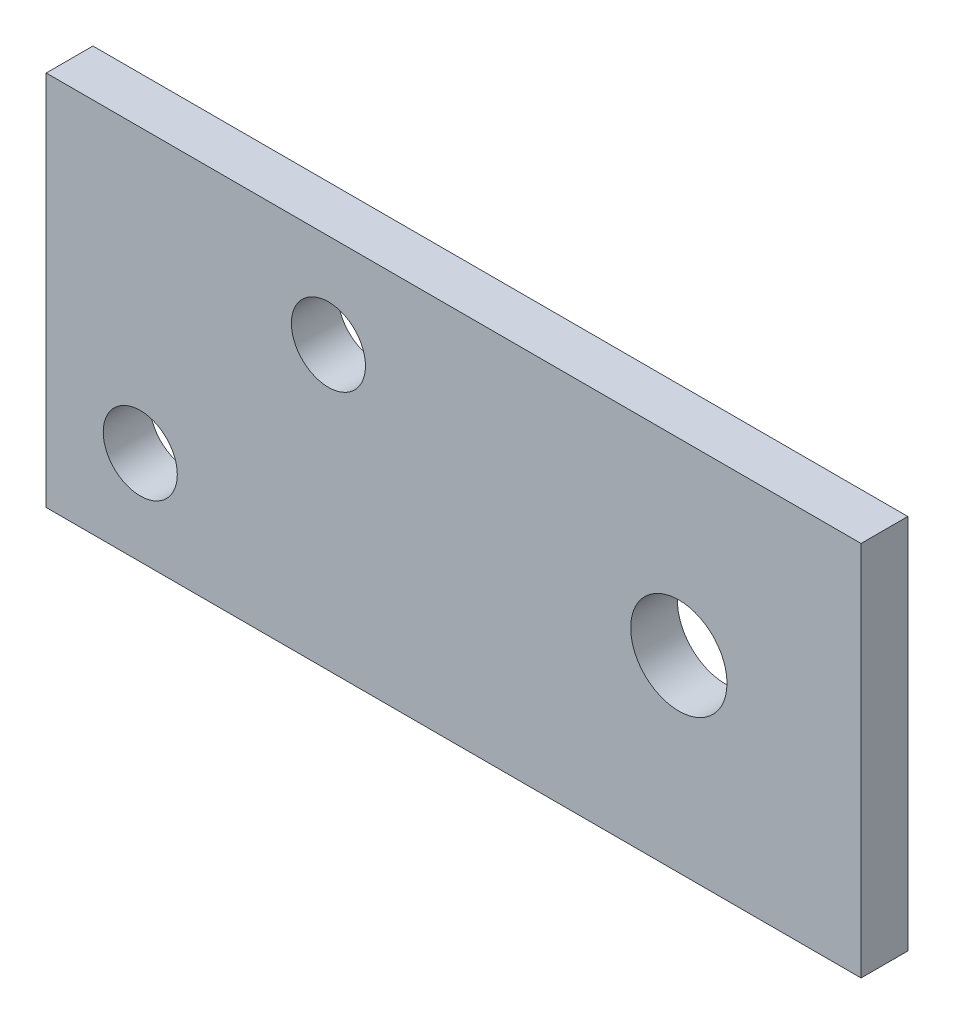
ISO-10303-21;
HEADER;
FILE_DESCRIPTION(('STEP AP214'),'2;1');
FILE_NAME('part.step','',(''),(''),'','','');
FILE_SCHEMA(('AUTOMOTIVE_DESIGN { 1 0 10303 214 1 1 1 1 }'));
ENDSEC;
DATA;
#1=APPLICATION_CONTEXT('core data for automotive mechanical design processes');
#2=APPLICATION_PROTOCOL_DEFINITION('international standard','automotive_design',2000,#1);
#3=PRODUCT_CONTEXT('',#1,'mechanical');
#4=PRODUCT('Part','Part','',(#3));
#5=PRODUCT_RELATED_PRODUCT_CATEGORY('part','',(#4));
#6=PRODUCT_DEFINITION_FORMATION('','',#4);
#7=PRODUCT_DEFINITION_CONTEXT('part definition',#1,'design');
#8=PRODUCT_DEFINITION('design','',#6,#7);
#9=PRODUCT_DEFINITION_SHAPE('','',#8);
#10=(LENGTH_UNIT() NAMED_UNIT(*) SI_UNIT(.MILLI.,.METRE.));
#11=(NAMED_UNIT(*) PLANE_ANGLE_UNIT() SI_UNIT($,.RADIAN.));
#12=(NAMED_UNIT(*) SI_UNIT($,.STERADIAN.) SOLID_ANGLE_UNIT());
#13=UNCERTAINTY_MEASURE_WITH_UNIT(LENGTH_MEASURE(1.E-05),#10,'distance_accuracy_value','');
#14=(GEOMETRIC_REPRESENTATION_CONTEXT(3) GLOBAL_UNCERTAINTY_ASSIGNED_CONTEXT((#13)) GLOBAL_UNIT_ASSIGNED_CONTEXT((#10,
#11,#12)) REPRESENTATION_CONTEXT('',''));
#15=CARTESIAN_POINT('',(0.,0.,0.));
#16=DIRECTION('',(0.,0.,1.));
#17=DIRECTION('',(1.,0.,0.));
#18=AXIS2_PLACEMENT_3D('',#15,#16,#17);
#19=CARTESIAN_POINT('',(0.,0.,6.31));
#20=DIRECTION('',(0.,0.,1.));
#21=DIRECTION('',(1.,0.,0.));
#22=AXIS2_PLACEMENT_3D('',#19,#20,#21);
#23=PLANE('',#22);
#24=CARTESIAN_POINT('',(-71.9,38.1,6.31));
#25=DIRECTION('',(0.,0.,1.));
#26=DIRECTION('',(1.,0.,0.));
#27=AXIS2_PLACEMENT_3D('',#24,#25,#26);
#28=CIRCLE('',#27,5.00000000000001);
#29=CARTESIAN_POINT('',(-66.9,38.1,6.31));
#30=VERTEX_POINT('',#29);
#31=EDGE_CURVE('E127',#30,#30,#28,.T.);
#32=ORIENTED_EDGE('',*,*,#31,.F.);
#33=EDGE_LOOP('',(#32));
#34=FACE_BOUND('',#33,.T.);
#35=CARTESIAN_POINT('',(-97.3,12.7,6.31));
#36=DIRECTION('',(0.,0.,1.));
#37=DIRECTION('',(1.,0.,0.));
#38=AXIS2_PLACEMENT_3D('',#35,#36,#37);
#39=CIRCLE('',#38,5.);
#40=CARTESIAN_POINT('',(-92.3,12.7,6.31));
#41=VERTEX_POINT('',#40);
#42=EDGE_CURVE('E117',#41,#41,#39,.T.);
#43=ORIENTED_EDGE('',*,*,#42,.F.);
#44=EDGE_LOOP('',(#43));
#45=FACE_BOUND('',#44,.T.);
#46=DIRECTION('',(-1.,0.,0.));
#47=VECTOR('',#46,1.);
#48=CARTESIAN_POINT('',(0.,50.8,6.31));
#49=LINE('',#48,#47);
#50=CARTESIAN_POINT('',(0.,50.8,6.31));
#51=VERTEX_POINT('',#50);
#52=CARTESIAN_POINT('',(-110.,50.8,6.31));
#53=VERTEX_POINT('',#52);
#54=EDGE_CURVE('E79',#51,#53,#49,.T.);
#55=ORIENTED_EDGE('',*,*,#54,.T.);
#56=DIRECTION('',(0.,-1.,0.));
#57=VECTOR('',#56,1.);
#58=CARTESIAN_POINT('',(-110.,50.8,6.31));
#59=LINE('',#58,#57);
#60=CARTESIAN_POINT('',(-110.,0.,6.31));
#61=VERTEX_POINT('',#60);
#62=EDGE_CURVE('E82',#53,#61,#59,.T.);
#63=ORIENTED_EDGE('',*,*,#62,.T.);
#64=DIRECTION('',(1.,0.,0.));
#65=VECTOR('',#64,1.);
#66=CARTESIAN_POINT('',(-110.,0.,6.31));
#67=LINE('',#66,#65);
#68=CARTESIAN_POINT('',(0.,0.,6.31));
#69=VERTEX_POINT('',#68);
#70=EDGE_CURVE('E86',#61,#69,#67,.T.);
#71=ORIENTED_EDGE('',*,*,#70,.T.);
#72=DIRECTION('',(0.,1.,0.));
#73=VECTOR('',#72,1.);
#74=CARTESIAN_POINT('',(0.,0.,6.31));
#75=LINE('',#74,#73);
#76=EDGE_CURVE('E50',#69,#51,#75,.T.);
#77=ORIENTED_EDGE('',*,*,#76,.T.);
#78=EDGE_LOOP('',(#55,#63,#71,#77));
#79=FACE_BOUND('',#78,.T.);
#80=CARTESIAN_POINT('',(-24.5999999998908,25.4013417539825,6.31));
#81=DIRECTION('',(0.,0.,1.));
#82=DIRECTION('',(1.,0.,0.));
#83=AXIS2_PLACEMENT_3D('',#80,#81,#82);
#84=CIRCLE('',#83,6.50134175398248);
#85=CARTESIAN_POINT('',(-18.0986582459083,25.4013417539825,6.31));
#86=VERTEX_POINT('',#85);
#87=EDGE_CURVE('E99',#86,#86,#84,.T.);
#88=ORIENTED_EDGE('',*,*,#87,.F.);
#89=EDGE_LOOP('',(#88));
#90=FACE_BOUND('',#89,.T.);
#91=ADVANCED_FACE('F33',(#34,#45,#79,#90),#23,.T.);
#92=CARTESIAN_POINT('',(0.,0.,0.));
#93=DIRECTION('',(0.,0.,1.));
#94=DIRECTION('',(1.,0.,0.));
#95=AXIS2_PLACEMENT_3D('',#92,#93,#94);
#96=PLANE('',#95);
#97=CARTESIAN_POINT('',(-71.9,38.1,0.));
#98=DIRECTION('',(0.,0.,-1.));
#99=DIRECTION('',(-1.,0.,0.));
#100=AXIS2_PLACEMENT_3D('',#97,#98,#99);
#101=CIRCLE('',#100,5.00000000000001);
#102=CARTESIAN_POINT('',(-76.9,38.1,0.));
#103=VERTEX_POINT('',#102);
#104=EDGE_CURVE('E130',#103,#103,#101,.T.);
#105=ORIENTED_EDGE('',*,*,#104,.F.);
#106=EDGE_LOOP('',(#105));
#107=FACE_BOUND('',#106,.T.);
#108=CARTESIAN_POINT('',(-97.3,12.7,0.));
#109=DIRECTION('',(0.,0.,-1.));
#110=DIRECTION('',(-1.,0.,0.));
#111=AXIS2_PLACEMENT_3D('',#108,#109,#110);
#112=CIRCLE('',#111,5.);
#113=CARTESIAN_POINT('',(-102.3,12.7,0.));
#114=VERTEX_POINT('',#113);
#115=EDGE_CURVE('E122',#114,#114,#112,.T.);
#116=ORIENTED_EDGE('',*,*,#115,.F.);
#117=EDGE_LOOP('',(#116));
#118=FACE_BOUND('',#117,.T.);
#119=DIRECTION('',(-1.,0.,0.));
#120=VECTOR('',#119,1.);
#121=CARTESIAN_POINT('',(-59.2,50.8,0.));
#122=LINE('',#121,#120);
#123=CARTESIAN_POINT('',(0.,50.8,0.));
#124=VERTEX_POINT('',#123);
#125=CARTESIAN_POINT('',(-110.,50.8,0.));
#126=VERTEX_POINT('',#125);
#127=EDGE_CURVE('E74',#124,#126,#122,.T.);
#128=ORIENTED_EDGE('',*,*,#127,.F.);
#129=DIRECTION('',(0.,1.,0.));
#130=VECTOR('',#129,1.);
#131=CARTESIAN_POINT('',(0.,0.,0.));
#132=LINE('',#131,#130);
#133=CARTESIAN_POINT('',(0.,0.,0.));
#134=VERTEX_POINT('',#133);
#135=EDGE_CURVE('E102',#134,#124,#132,.T.);
#136=ORIENTED_EDGE('',*,*,#135,.F.);
#137=DIRECTION('',(1.,0.,0.));
#138=VECTOR('',#137,1.);
#139=CARTESIAN_POINT('',(-110.,0.,0.));
#140=LINE('',#139,#138);
#141=CARTESIAN_POINT('',(-110.,0.,0.));
#142=VERTEX_POINT('',#141);
#143=EDGE_CURVE('E67',#142,#134,#140,.T.);
#144=ORIENTED_EDGE('',*,*,#143,.F.);
#145=DIRECTION('',(0.,-1.,0.));
#146=VECTOR('',#145,1.);
#147=CARTESIAN_POINT('',(-110.,50.8,0.));
#148=LINE('',#147,#146);
#149=EDGE_CURVE('E90',#126,#142,#148,.T.);
#150=ORIENTED_EDGE('',*,*,#149,.F.);
#151=EDGE_LOOP('',(#128,#136,#144,#150));
#152=FACE_BOUND('',#151,.T.);
#153=CARTESIAN_POINT('',(-24.5999999998908,25.4013417539825,0.));
#154=DIRECTION('',(0.,0.,1.));
#155=DIRECTION('',(1.,0.,0.));
#156=AXIS2_PLACEMENT_3D('',#153,#154,#155);
#157=CIRCLE('',#156,6.50134175398248);
#158=CARTESIAN_POINT('',(-18.0986582459083,25.4013417539825,0.));
#159=VERTEX_POINT('',#158);
#160=EDGE_CURVE('E115',#159,#159,#157,.T.);
#161=ORIENTED_EDGE('',*,*,#160,.T.);
#162=EDGE_LOOP('',(#161));
#163=FACE_BOUND('',#162,.T.);
#164=ADVANCED_FACE('F108',(#107,#118,#152,#163),#96,.F.);
#165=CARTESIAN_POINT('',(-59.2,50.8,6.31));
#166=DIRECTION('',(0.,-1.,0.));
#167=DIRECTION('',(1.,0.,0.));
#168=AXIS2_PLACEMENT_3D('',#165,#166,#167);
#169=PLANE('',#168);
#170=ORIENTED_EDGE('',*,*,#127,.T.);
#171=DIRECTION('',(0.,0.,-1.));
#172=VECTOR('',#171,1.);
#173=CARTESIAN_POINT('',(-110.,50.8,6.31));
#174=LINE('',#173,#172);
#175=EDGE_CURVE('E11',#53,#126,#174,.T.);
#176=ORIENTED_EDGE('',*,*,#175,.F.);
#177=ORIENTED_EDGE('',*,*,#54,.F.);
#178=DIRECTION('',(0.,0.,-1.));
#179=VECTOR('',#178,1.);
#180=CARTESIAN_POINT('',(0.,50.8,6.31));
#181=LINE('',#180,#179);
#182=EDGE_CURVE('E94',#51,#124,#181,.T.);
#183=ORIENTED_EDGE('',*,*,#182,.T.);
#184=EDGE_LOOP('',(#170,#176,#177,#183));
#185=FACE_BOUND('',#184,.T.);
#186=ADVANCED_FACE('F35',(#185),#169,.F.);
#187=CARTESIAN_POINT('',(-110.,50.8,6.31));
#188=DIRECTION('',(1.,0.,0.));
#189=DIRECTION('',(0.,0.,-1.));
#190=AXIS2_PLACEMENT_3D('',#187,#188,#189);
#191=PLANE('',#190);
#192=ORIENTED_EDGE('',*,*,#149,.T.);
#193=DIRECTION('',(0.,0.,-1.));
#194=VECTOR('',#193,1.);
#195=CARTESIAN_POINT('',(-110.,0.,6.31));
#196=LINE('',#195,#194);
#197=EDGE_CURVE('E42',#61,#142,#196,.T.);
#198=ORIENTED_EDGE('',*,*,#197,.F.);
#199=ORIENTED_EDGE('',*,*,#62,.F.);
#200=ORIENTED_EDGE('',*,*,#175,.T.);
#201=EDGE_LOOP('',(#192,#198,#199,#200));
#202=FACE_BOUND('',#201,.T.);
#203=ADVANCED_FACE('F89',(#202),#191,.F.);
#204=CARTESIAN_POINT('',(-110.,0.,6.31));
#205=DIRECTION('',(0.,1.,0.));
#206=DIRECTION('',(0.,0.,1.));
#207=AXIS2_PLACEMENT_3D('',#204,#205,#206);
#208=PLANE('',#207);
#209=ORIENTED_EDGE('',*,*,#143,.T.);
#210=DIRECTION('',(0.,0.,-1.));
#211=VECTOR('',#210,1.);
#212=CARTESIAN_POINT('',(0.,0.,6.31));
#213=LINE('',#212,#211);
#214=EDGE_CURVE('E91',#69,#134,#213,.T.);
#215=ORIENTED_EDGE('',*,*,#214,.F.);
#216=ORIENTED_EDGE('',*,*,#70,.F.);
#217=ORIENTED_EDGE('',*,*,#197,.T.);
#218=EDGE_LOOP('',(#209,#215,#216,#217));
#219=FACE_BOUND('',#218,.T.);
#220=ADVANCED_FACE('F92',(#219),#208,.F.);
#221=CARTESIAN_POINT('',(0.,0.,6.31));
#222=DIRECTION('',(-1.,0.,0.));
#223=DIRECTION('',(0.,0.,1.));
#224=AXIS2_PLACEMENT_3D('',#221,#222,#223);
#225=PLANE('',#224);
#226=ORIENTED_EDGE('',*,*,#135,.T.);
#227=ORIENTED_EDGE('',*,*,#182,.F.);
#228=ORIENTED_EDGE('',*,*,#76,.F.);
#229=ORIENTED_EDGE('',*,*,#214,.T.);
#230=EDGE_LOOP('',(#226,#227,#228,#229));
#231=FACE_BOUND('',#230,.T.);
#232=ADVANCED_FACE('F107',(#231),#225,.F.);
#233=CARTESIAN_POINT('',(-24.5999999998908,25.4013417539825,6.31));
#234=DIRECTION('',(0.,0.,-1.));
#235=DIRECTION('',(-1.,0.,0.));
#236=AXIS2_PLACEMENT_3D('',#233,#234,#235);
#237=CYLINDRICAL_SURFACE('',#236,6.50134175398248);
#238=ORIENTED_EDGE('',*,*,#87,.T.);
#239=EDGE_LOOP('',(#238));
#240=FACE_BOUND('',#239,.T.);
#241=ORIENTED_EDGE('',*,*,#160,.F.);
#242=EDGE_LOOP('',(#241));
#243=FACE_BOUND('',#242,.T.);
#244=ADVANCED_FACE('F140',(#240,#243),#237,.F.);
#245=CARTESIAN_POINT('',(-97.3,12.7,10.));
#246=DIRECTION('',(0.,0.,-1.));
#247=DIRECTION('',(-1.,0.,0.));
#248=AXIS2_PLACEMENT_3D('',#245,#246,#247);
#249=CYLINDRICAL_SURFACE('',#248,5.);
#250=ORIENTED_EDGE('',*,*,#42,.T.);
#251=EDGE_LOOP('',(#250));
#252=FACE_BOUND('',#251,.T.);
#253=ORIENTED_EDGE('',*,*,#115,.T.);
#254=EDGE_LOOP('',(#253));
#255=FACE_BOUND('',#254,.T.);
#256=ADVANCED_FACE('F138',(#252,#255),#249,.F.);
#257=CARTESIAN_POINT('',(-71.9,38.1,10.));
#258=DIRECTION('',(0.,0.,-1.));
#259=DIRECTION('',(-1.,0.,0.));
#260=AXIS2_PLACEMENT_3D('',#257,#258,#259);
#261=CYLINDRICAL_SURFACE('',#260,5.00000000000001);
#262=ORIENTED_EDGE('',*,*,#31,.T.);
#263=EDGE_LOOP('',(#262));
#264=FACE_BOUND('',#263,.T.);
#265=ORIENTED_EDGE('',*,*,#104,.T.);
#266=EDGE_LOOP('',(#265));
#267=FACE_BOUND('',#266,.T.);
#268=ADVANCED_FACE('F134',(#264,#267),#261,.F.);
#269=CLOSED_SHELL('',(#91,#164,#186,#203,#220,#232,#244,#256,#268));
#270=MANIFOLD_SOLID_BREP('B2',#269);
#271=ADVANCED_BREP_SHAPE_REPRESENTATION('',(#18,#270),#14);
#272=SHAPE_DEFINITION_REPRESENTATION(#9,#271);
ENDSEC;
END-ISO-10303-21;
